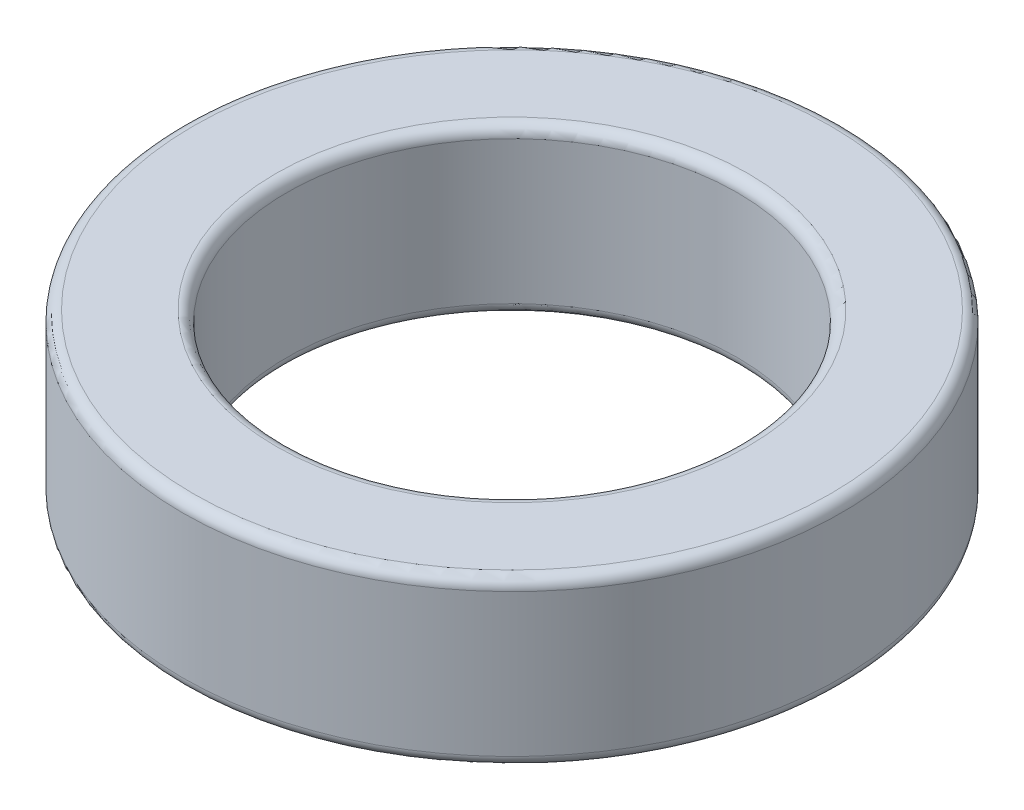
ISO-10303-21;
HEADER;
FILE_DESCRIPTION(('STEP AP214'),'2;1');
FILE_NAME('part.step','',(''),(''),'','','');
FILE_SCHEMA(('AUTOMOTIVE_DESIGN { 1 0 10303 214 1 1 1 1 }'));
ENDSEC;
DATA;
#1=APPLICATION_CONTEXT('core data for automotive mechanical design processes');
#2=APPLICATION_PROTOCOL_DEFINITION('international standard','automotive_design',2000,#1);
#3=PRODUCT_CONTEXT('',#1,'mechanical');
#4=PRODUCT('Part','Part','',(#3));
#5=PRODUCT_RELATED_PRODUCT_CATEGORY('part','',(#4));
#6=PRODUCT_DEFINITION_FORMATION('','',#4);
#7=PRODUCT_DEFINITION_CONTEXT('part definition',#1,'design');
#8=PRODUCT_DEFINITION('design','',#6,#7);
#9=PRODUCT_DEFINITION_SHAPE('','',#8);
#10=(LENGTH_UNIT() NAMED_UNIT(*) SI_UNIT(.MILLI.,.METRE.));
#11=(NAMED_UNIT(*) PLANE_ANGLE_UNIT() SI_UNIT($,.RADIAN.));
#12=(NAMED_UNIT(*) SI_UNIT($,.STERADIAN.) SOLID_ANGLE_UNIT());
#13=UNCERTAINTY_MEASURE_WITH_UNIT(LENGTH_MEASURE(1.E-05),#10,'distance_accuracy_value','');
#14=(GEOMETRIC_REPRESENTATION_CONTEXT(3) GLOBAL_UNCERTAINTY_ASSIGNED_CONTEXT((#13)) GLOBAL_UNIT_ASSIGNED_CONTEXT((#10,
#11,#12)) REPRESENTATION_CONTEXT('',''));
#15=CARTESIAN_POINT('',(0.,0.,0.));
#16=DIRECTION('',(0.,0.,1.));
#17=DIRECTION('',(1.,0.,0.));
#18=AXIS2_PLACEMENT_3D('',#15,#16,#17);
#19=CARTESIAN_POINT('',(0.,0.75,0.));
#20=DIRECTION('',(0.,1.,0.));
#21=DIRECTION('',(0.,0.,1.));
#22=AXIS2_PLACEMENT_3D('',#19,#20,#21);
#23=PLANE('',#22);
#24=CARTESIAN_POINT('',(0.,0.75,0.));
#25=DIRECTION('',(0.,1.,0.));
#26=DIRECTION('',(0.,0.,1.));
#27=AXIS2_PLACEMENT_3D('',#24,#25,#26);
#28=CIRCLE('',#27,2.15);
#29=CARTESIAN_POINT('',(0.,0.75,2.15));
#30=VERTEX_POINT('',#29);
#31=EDGE_CURVE('E10',#30,#30,#28,.F.);
#32=ORIENTED_EDGE('',*,*,#31,.T.);
#33=EDGE_LOOP('',(#32));
#34=FACE_BOUND('',#33,.T.);
#35=CARTESIAN_POINT('',(0.,0.75,0.));
#36=DIRECTION('',(0.,1.,0.));
#37=DIRECTION('',(0.,0.,1.));
#38=AXIS2_PLACEMENT_3D('',#35,#36,#37);
#39=CIRCLE('',#38,2.9);
#40=CARTESIAN_POINT('',(0.,0.75,2.9));
#41=VERTEX_POINT('',#40);
#42=EDGE_CURVE('E38',#41,#41,#39,.T.);
#43=ORIENTED_EDGE('',*,*,#42,.T.);
#44=EDGE_LOOP('',(#43));
#45=FACE_BOUND('',#44,.T.);
#46=ADVANCED_FACE('F31',(#34,#45),#23,.T.);
#47=CARTESIAN_POINT('',(0.,-0.75,0.));
#48=DIRECTION('',(0.,1.,0.));
#49=DIRECTION('',(0.,0.,1.));
#50=AXIS2_PLACEMENT_3D('',#47,#48,#49);
#51=PLANE('',#50);
#52=CARTESIAN_POINT('',(0.,-0.75,0.));
#53=DIRECTION('',(0.,1.,0.));
#54=DIRECTION('',(0.,0.,1.));
#55=AXIS2_PLACEMENT_3D('',#52,#53,#54);
#56=CIRCLE('',#55,2.15);
#57=CARTESIAN_POINT('',(0.,-0.75,2.15));
#58=VERTEX_POINT('',#57);
#59=EDGE_CURVE('E57',#58,#58,#56,.T.);
#60=ORIENTED_EDGE('',*,*,#59,.T.);
#61=EDGE_LOOP('',(#60));
#62=FACE_BOUND('',#61,.T.);
#63=CARTESIAN_POINT('',(0.,-0.75,0.));
#64=DIRECTION('',(0.,1.,0.));
#65=DIRECTION('',(0.,0.,1.));
#66=AXIS2_PLACEMENT_3D('',#63,#64,#65);
#67=CIRCLE('',#66,2.9);
#68=CARTESIAN_POINT('',(0.,-0.75,2.9));
#69=VERTEX_POINT('',#68);
#70=EDGE_CURVE('E60',#69,#69,#67,.F.);
#71=ORIENTED_EDGE('',*,*,#70,.T.);
#72=EDGE_LOOP('',(#71));
#73=FACE_BOUND('',#72,.T.);
#74=ADVANCED_FACE('F64',(#62,#73),#51,.F.);
#75=CARTESIAN_POINT('',(0.,0.75,0.));
#76=DIRECTION('',(0.,-1.,0.));
#77=DIRECTION('',(0.,0.,-1.));
#78=AXIS2_PLACEMENT_3D('',#75,#76,#77);
#79=CYLINDRICAL_SURFACE('',#78,3.);
#80=CARTESIAN_POINT('',(0.,-0.65,0.));
#81=DIRECTION('',(0.,1.,0.));
#82=DIRECTION('',(0.,0.,1.));
#83=AXIS2_PLACEMENT_3D('',#80,#81,#82);
#84=CIRCLE('',#83,3.);
#85=CARTESIAN_POINT('',(0.,-0.65,3.));
#86=VERTEX_POINT('',#85);
#87=EDGE_CURVE('E42',#86,#86,#84,.T.);
#88=ORIENTED_EDGE('',*,*,#87,.T.);
#89=EDGE_LOOP('',(#88));
#90=FACE_BOUND('',#89,.T.);
#91=CARTESIAN_POINT('',(0.,0.65,0.));
#92=DIRECTION('',(0.,1.,0.));
#93=DIRECTION('',(0.,0.,1.));
#94=AXIS2_PLACEMENT_3D('',#91,#92,#93);
#95=CIRCLE('',#94,3.);
#96=CARTESIAN_POINT('',(0.,0.65,3.));
#97=VERTEX_POINT('',#96);
#98=EDGE_CURVE('E46',#97,#97,#95,.F.);
#99=ORIENTED_EDGE('',*,*,#98,.T.);
#100=EDGE_LOOP('',(#99));
#101=FACE_BOUND('',#100,.T.);
#102=ADVANCED_FACE('F74',(#90,#101),#79,.T.);
#103=CARTESIAN_POINT('',(0.,0.75,0.));
#104=DIRECTION('',(0.,-1.,0.));
#105=DIRECTION('',(0.,0.,-1.));
#106=AXIS2_PLACEMENT_3D('',#103,#104,#105);
#107=CYLINDRICAL_SURFACE('',#106,2.05);
#108=CARTESIAN_POINT('',(0.,-0.65,0.));
#109=DIRECTION('',(0.,1.,0.));
#110=DIRECTION('',(0.,0.,1.));
#111=AXIS2_PLACEMENT_3D('',#108,#109,#110);
#112=CIRCLE('',#111,2.05);
#113=CARTESIAN_POINT('',(0.,-0.65,2.05));
#114=VERTEX_POINT('',#113);
#115=EDGE_CURVE('E51',#114,#114,#112,.F.);
#116=ORIENTED_EDGE('',*,*,#115,.T.);
#117=EDGE_LOOP('',(#116));
#118=FACE_BOUND('',#117,.T.);
#119=CARTESIAN_POINT('',(0.,0.65,0.));
#120=DIRECTION('',(0.,1.,0.));
#121=DIRECTION('',(0.,0.,1.));
#122=AXIS2_PLACEMENT_3D('',#119,#120,#121);
#123=CIRCLE('',#122,2.05);
#124=CARTESIAN_POINT('',(0.,0.65,2.05));
#125=VERTEX_POINT('',#124);
#126=EDGE_CURVE('E54',#125,#125,#123,.T.);
#127=ORIENTED_EDGE('',*,*,#126,.T.);
#128=EDGE_LOOP('',(#127));
#129=FACE_BOUND('',#128,.T.);
#130=ADVANCED_FACE('F77',(#118,#129),#107,.F.);
#131=CARTESIAN_POINT('',(0.,-0.65,0.));
#132=DIRECTION('',(0.,1.,0.));
#133=DIRECTION('',(0.,0.,1.));
#134=AXIS2_PLACEMENT_3D('',#131,#132,#133);
#135=TOROIDAL_SURFACE('',#134,2.15,0.1);
#136=ORIENTED_EDGE('',*,*,#115,.F.);
#137=EDGE_LOOP('',(#136));
#138=FACE_BOUND('',#137,.T.);
#139=ORIENTED_EDGE('',*,*,#59,.F.);
#140=EDGE_LOOP('',(#139));
#141=FACE_BOUND('',#140,.T.);
#142=ADVANCED_FACE('F70',(#138,#141),#135,.T.);
#143=CARTESIAN_POINT('',(0.,-0.65,0.));
#144=DIRECTION('',(0.,1.,0.));
#145=DIRECTION('',(0.,0.,1.));
#146=AXIS2_PLACEMENT_3D('',#143,#144,#145);
#147=TOROIDAL_SURFACE('',#146,2.9,0.1);
#148=ORIENTED_EDGE('',*,*,#70,.F.);
#149=EDGE_LOOP('',(#148));
#150=FACE_BOUND('',#149,.T.);
#151=ORIENTED_EDGE('',*,*,#87,.F.);
#152=EDGE_LOOP('',(#151));
#153=FACE_BOUND('',#152,.T.);
#154=ADVANCED_FACE('F66',(#150,#153),#147,.T.);
#155=CARTESIAN_POINT('',(0.,0.65,0.));
#156=DIRECTION('',(0.,1.,0.));
#157=DIRECTION('',(0.,0.,1.));
#158=AXIS2_PLACEMENT_3D('',#155,#156,#157);
#159=TOROIDAL_SURFACE('',#158,2.15,0.1);
#160=ORIENTED_EDGE('',*,*,#31,.F.);
#161=EDGE_LOOP('',(#160));
#162=FACE_BOUND('',#161,.T.);
#163=ORIENTED_EDGE('',*,*,#126,.F.);
#164=EDGE_LOOP('',(#163));
#165=FACE_BOUND('',#164,.T.);
#166=ADVANCED_FACE('F69',(#162,#165),#159,.T.);
#167=CARTESIAN_POINT('',(0.,0.65,0.));
#168=DIRECTION('',(0.,1.,0.));
#169=DIRECTION('',(0.,0.,1.));
#170=AXIS2_PLACEMENT_3D('',#167,#168,#169);
#171=TOROIDAL_SURFACE('',#170,2.9,0.1);
#172=ORIENTED_EDGE('',*,*,#98,.F.);
#173=EDGE_LOOP('',(#172));
#174=FACE_BOUND('',#173,.T.);
#175=ORIENTED_EDGE('',*,*,#42,.F.);
#176=EDGE_LOOP('',(#175));
#177=FACE_BOUND('',#176,.T.);
#178=ADVANCED_FACE('F33',(#174,#177),#171,.T.);
#179=CLOSED_SHELL('',(#46,#74,#102,#130,#142,#154,#166,#178));
#180=MANIFOLD_SOLID_BREP('B2',#179);
#181=ADVANCED_BREP_SHAPE_REPRESENTATION('',(#18,#180),#14);
#182=SHAPE_DEFINITION_REPRESENTATION(#9,#181);
ENDSEC;
END-ISO-10303-21;
